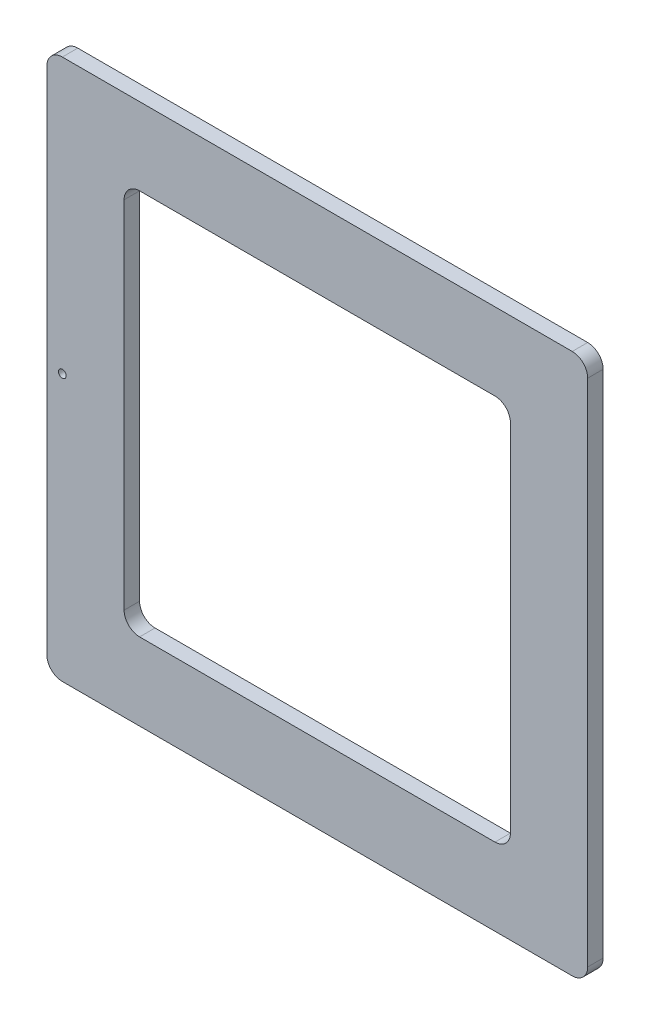
ISO-10303-21;
HEADER;
FILE_DESCRIPTION(('STEP AP214'),'2;1');
FILE_NAME('part.step','',(''),(''),'','','');
FILE_SCHEMA(('AUTOMOTIVE_DESIGN { 1 0 10303 214 1 1 1 1 }'));
ENDSEC;
DATA;
#1=APPLICATION_CONTEXT('core data for automotive mechanical design processes');
#2=APPLICATION_PROTOCOL_DEFINITION('international standard','automotive_design',2000,#1);
#3=PRODUCT_CONTEXT('',#1,'mechanical');
#4=PRODUCT('Part','Part','',(#3));
#5=PRODUCT_RELATED_PRODUCT_CATEGORY('part','',(#4));
#6=PRODUCT_DEFINITION_FORMATION('','',#4);
#7=PRODUCT_DEFINITION_CONTEXT('part definition',#1,'design');
#8=PRODUCT_DEFINITION('design','',#6,#7);
#9=PRODUCT_DEFINITION_SHAPE('','',#8);
#10=(LENGTH_UNIT() NAMED_UNIT(*) SI_UNIT(.MILLI.,.METRE.));
#11=(NAMED_UNIT(*) PLANE_ANGLE_UNIT() SI_UNIT($,.RADIAN.));
#12=(NAMED_UNIT(*) SI_UNIT($,.STERADIAN.) SOLID_ANGLE_UNIT());
#13=UNCERTAINTY_MEASURE_WITH_UNIT(LENGTH_MEASURE(1.E-05),#10,'distance_accuracy_value','');
#14=(GEOMETRIC_REPRESENTATION_CONTEXT(3) GLOBAL_UNCERTAINTY_ASSIGNED_CONTEXT((#13)) GLOBAL_UNIT_ASSIGNED_CONTEXT((#10,
#11,#12)) REPRESENTATION_CONTEXT('',''));
#15=CARTESIAN_POINT('',(0.,0.,0.));
#16=DIRECTION('',(0.,0.,1.));
#17=DIRECTION('',(1.,0.,0.));
#18=AXIS2_PLACEMENT_3D('',#15,#16,#17);
#19=CARTESIAN_POINT('',(33.,33.,2.));
#20=DIRECTION('',(0.,0.,-1.));
#21=DIRECTION('',(-1.,0.,0.));
#22=AXIS2_PLACEMENT_3D('',#19,#20,#21);
#23=PLANE('',#22);
#24=CARTESIAN_POINT('',(-33.,-0.499999999999987,2.));
#25=DIRECTION('',(0.,0.,1.));
#26=DIRECTION('',(1.,0.,0.));
#27=AXIS2_PLACEMENT_3D('',#24,#25,#26);
#28=CIRCLE('',#27,0.499999999999999);
#29=CARTESIAN_POINT('',(-32.5,-0.499999999999987,2.));
#30=VERTEX_POINT('',#29);
#31=EDGE_CURVE('E185',#30,#30,#28,.T.);
#32=ORIENTED_EDGE('',*,*,#31,.F.);
#33=EDGE_LOOP('',(#32));
#34=FACE_BOUND('',#33,.T.);
#35=CARTESIAN_POINT('',(33.,33.,2.));
#36=DIRECTION('',(0.,0.,1.));
#37=DIRECTION('',(-1.,0.,0.));
#38=AXIS2_PLACEMENT_3D('',#35,#36,#37);
#39=CIRCLE('',#38,2.);
#40=CARTESIAN_POINT('',(35.,33.,2.));
#41=VERTEX_POINT('',#40);
#42=CARTESIAN_POINT('',(33.,35.,2.));
#43=VERTEX_POINT('',#42);
#44=EDGE_CURVE('E215',#41,#43,#39,.T.);
#45=ORIENTED_EDGE('',*,*,#44,.T.);
#46=DIRECTION('',(-1.,0.,0.));
#47=VECTOR('',#46,1.);
#48=CARTESIAN_POINT('',(33.,35.,2.));
#49=LINE('',#48,#47);
#50=CARTESIAN_POINT('',(-33.,35.,2.));
#51=VERTEX_POINT('',#50);
#52=EDGE_CURVE('E218',#43,#51,#49,.T.);
#53=ORIENTED_EDGE('',*,*,#52,.T.);
#54=CARTESIAN_POINT('',(-33.,33.,2.));
#55=DIRECTION('',(0.,0.,1.));
#56=DIRECTION('',(-1.,0.,0.));
#57=AXIS2_PLACEMENT_3D('',#54,#55,#56);
#58=CIRCLE('',#57,2.);
#59=CARTESIAN_POINT('',(-35.,33.,2.));
#60=VERTEX_POINT('',#59);
#61=EDGE_CURVE('E221',#51,#60,#58,.T.);
#62=ORIENTED_EDGE('',*,*,#61,.T.);
#63=DIRECTION('',(0.,-1.,0.));
#64=VECTOR('',#63,1.);
#65=CARTESIAN_POINT('',(-35.,-33.,2.));
#66=LINE('',#65,#64);
#67=CARTESIAN_POINT('',(-35.,-33.,2.));
#68=VERTEX_POINT('',#67);
#69=EDGE_CURVE('E223',#60,#68,#66,.T.);
#70=ORIENTED_EDGE('',*,*,#69,.T.);
#71=CARTESIAN_POINT('',(-33.,-33.,2.));
#72=DIRECTION('',(0.,0.,1.));
#73=DIRECTION('',(-1.,0.,0.));
#74=AXIS2_PLACEMENT_3D('',#71,#72,#73);
#75=CIRCLE('',#74,2.);
#76=CARTESIAN_POINT('',(-33.,-35.,2.));
#77=VERTEX_POINT('',#76);
#78=EDGE_CURVE('E225',#68,#77,#75,.T.);
#79=ORIENTED_EDGE('',*,*,#78,.T.);
#80=DIRECTION('',(1.,0.,0.));
#81=VECTOR('',#80,1.);
#82=CARTESIAN_POINT('',(33.,-35.,2.));
#83=LINE('',#82,#81);
#84=CARTESIAN_POINT('',(33.,-35.,2.));
#85=VERTEX_POINT('',#84);
#86=EDGE_CURVE('E227',#77,#85,#83,.T.);
#87=ORIENTED_EDGE('',*,*,#86,.T.);
#88=CARTESIAN_POINT('',(33.,-33.,2.));
#89=DIRECTION('',(0.,0.,1.));
#90=DIRECTION('',(-1.,0.,0.));
#91=AXIS2_PLACEMENT_3D('',#88,#89,#90);
#92=CIRCLE('',#91,2.);
#93=CARTESIAN_POINT('',(35.,-33.,2.));
#94=VERTEX_POINT('',#93);
#95=EDGE_CURVE('E229',#85,#94,#92,.T.);
#96=ORIENTED_EDGE('',*,*,#95,.T.);
#97=DIRECTION('',(0.,1.,0.));
#98=VECTOR('',#97,1.);
#99=CARTESIAN_POINT('',(35.,-33.,2.));
#100=LINE('',#99,#98);
#101=EDGE_CURVE('E231',#94,#41,#100,.T.);
#102=ORIENTED_EDGE('',*,*,#101,.T.);
#103=EDGE_LOOP('',(#45,#53,#62,#70,#79,#87,#96,#102));
#104=FACE_BOUND('',#103,.T.);
#105=CARTESIAN_POINT('',(23.,-23.,2.));
#106=DIRECTION('',(0.,0.,1.));
#107=DIRECTION('',(-1.,0.,0.));
#108=AXIS2_PLACEMENT_3D('',#105,#106,#107);
#109=CIRCLE('',#108,2.);
#110=CARTESIAN_POINT('',(23.,-25.,2.));
#111=VERTEX_POINT('',#110);
#112=CARTESIAN_POINT('',(25.,-23.,2.));
#113=VERTEX_POINT('',#112);
#114=EDGE_CURVE('E148',#111,#113,#109,.T.);
#115=ORIENTED_EDGE('',*,*,#114,.F.);
#116=DIRECTION('',(1.,0.,0.));
#117=VECTOR('',#116,1.);
#118=CARTESIAN_POINT('',(23.,-25.,2.));
#119=LINE('',#118,#117);
#120=CARTESIAN_POINT('',(-23.,-25.,2.));
#121=VERTEX_POINT('',#120);
#122=EDGE_CURVE('E182',#121,#111,#119,.T.);
#123=ORIENTED_EDGE('',*,*,#122,.F.);
#124=CARTESIAN_POINT('',(-23.,-23.,2.));
#125=DIRECTION('',(0.,0.,1.));
#126=DIRECTION('',(-1.,0.,0.));
#127=AXIS2_PLACEMENT_3D('',#124,#125,#126);
#128=CIRCLE('',#127,2.);
#129=CARTESIAN_POINT('',(-25.,-23.,2.));
#130=VERTEX_POINT('',#129);
#131=EDGE_CURVE('E180',#130,#121,#128,.T.);
#132=ORIENTED_EDGE('',*,*,#131,.F.);
#133=DIRECTION('',(0.,-1.,0.));
#134=VECTOR('',#133,1.);
#135=CARTESIAN_POINT('',(-25.,-23.,2.));
#136=LINE('',#135,#134);
#137=CARTESIAN_POINT('',(-25.,23.,2.));
#138=VERTEX_POINT('',#137);
#139=EDGE_CURVE('E178',#138,#130,#136,.T.);
#140=ORIENTED_EDGE('',*,*,#139,.F.);
#141=CARTESIAN_POINT('',(-23.,23.,2.));
#142=DIRECTION('',(0.,0.,1.));
#143=DIRECTION('',(1.,0.,0.));
#144=AXIS2_PLACEMENT_3D('',#141,#142,#143);
#145=CIRCLE('',#144,2.);
#146=CARTESIAN_POINT('',(-23.,25.,2.));
#147=VERTEX_POINT('',#146);
#148=EDGE_CURVE('E176',#147,#138,#145,.T.);
#149=ORIENTED_EDGE('',*,*,#148,.F.);
#150=DIRECTION('',(-1.,0.,0.));
#151=VECTOR('',#150,1.);
#152=CARTESIAN_POINT('',(23.,25.,2.));
#153=LINE('',#152,#151);
#154=CARTESIAN_POINT('',(23.,25.,2.));
#155=VERTEX_POINT('',#154);
#156=EDGE_CURVE('E171',#155,#147,#153,.T.);
#157=ORIENTED_EDGE('',*,*,#156,.F.);
#158=CARTESIAN_POINT('',(23.,23.,2.));
#159=DIRECTION('',(0.,0.,1.));
#160=DIRECTION('',(-1.,0.,0.));
#161=AXIS2_PLACEMENT_3D('',#158,#159,#160);
#162=CIRCLE('',#161,2.);
#163=CARTESIAN_POINT('',(25.,23.,2.));
#164=VERTEX_POINT('',#163);
#165=EDGE_CURVE('E169',#164,#155,#162,.T.);
#166=ORIENTED_EDGE('',*,*,#165,.F.);
#167=DIRECTION('',(0.,1.,0.));
#168=VECTOR('',#167,1.);
#169=CARTESIAN_POINT('',(25.,-23.,2.));
#170=LINE('',#169,#168);
#171=EDGE_CURVE('E156',#113,#164,#170,.T.);
#172=ORIENTED_EDGE('',*,*,#171,.F.);
#173=EDGE_LOOP('',(#115,#123,#132,#140,#149,#157,#166,#172));
#174=FACE_BOUND('',#173,.T.);
#175=ADVANCED_FACE('F35',(#34,#104,#174),#23,.F.);
#176=CARTESIAN_POINT('',(33.,33.,0.));
#177=DIRECTION('',(0.,0.,-1.));
#178=DIRECTION('',(-1.,0.,0.));
#179=AXIS2_PLACEMENT_3D('',#176,#177,#178);
#180=PLANE('',#179);
#181=CARTESIAN_POINT('',(-33.,-0.499999999999987,0.));
#182=DIRECTION('',(0.,0.,1.));
#183=DIRECTION('',(1.,0.,0.));
#184=AXIS2_PLACEMENT_3D('',#181,#182,#183);
#185=CIRCLE('',#184,0.499999999999999);
#186=CARTESIAN_POINT('',(-32.5,-0.499999999999987,0.));
#187=VERTEX_POINT('',#186);
#188=EDGE_CURVE('E370',#187,#187,#185,.T.);
#189=ORIENTED_EDGE('',*,*,#188,.T.);
#190=EDGE_LOOP('',(#189));
#191=FACE_BOUND('',#190,.T.);
#192=CARTESIAN_POINT('',(33.,33.,0.));
#193=DIRECTION('',(0.,0.,1.));
#194=DIRECTION('',(-1.,0.,0.));
#195=AXIS2_PLACEMENT_3D('',#192,#193,#194);
#196=CIRCLE('',#195,2.);
#197=CARTESIAN_POINT('',(35.,33.,0.));
#198=VERTEX_POINT('',#197);
#199=CARTESIAN_POINT('',(33.,35.,0.));
#200=VERTEX_POINT('',#199);
#201=EDGE_CURVE('E164',#198,#200,#196,.T.);
#202=ORIENTED_EDGE('',*,*,#201,.F.);
#203=DIRECTION('',(0.,1.,0.));
#204=VECTOR('',#203,1.);
#205=CARTESIAN_POINT('',(35.,-33.,0.));
#206=LINE('',#205,#204);
#207=CARTESIAN_POINT('',(35.,-33.,0.));
#208=VERTEX_POINT('',#207);
#209=EDGE_CURVE('E219',#208,#198,#206,.T.);
#210=ORIENTED_EDGE('',*,*,#209,.F.);
#211=CARTESIAN_POINT('',(33.,-33.,0.));
#212=DIRECTION('',(0.,0.,1.));
#213=DIRECTION('',(-1.,0.,0.));
#214=AXIS2_PLACEMENT_3D('',#211,#212,#213);
#215=CIRCLE('',#214,2.);
#216=CARTESIAN_POINT('',(33.,-35.,0.));
#217=VERTEX_POINT('',#216);
#218=EDGE_CURVE('E246',#217,#208,#215,.T.);
#219=ORIENTED_EDGE('',*,*,#218,.F.);
#220=DIRECTION('',(1.,0.,0.));
#221=VECTOR('',#220,1.);
#222=CARTESIAN_POINT('',(33.,-35.,0.));
#223=LINE('',#222,#221);
#224=CARTESIAN_POINT('',(-33.,-35.,0.));
#225=VERTEX_POINT('',#224);
#226=EDGE_CURVE('E244',#225,#217,#223,.T.);
#227=ORIENTED_EDGE('',*,*,#226,.F.);
#228=CARTESIAN_POINT('',(-33.,-33.,0.));
#229=DIRECTION('',(0.,0.,1.));
#230=DIRECTION('',(-1.,0.,0.));
#231=AXIS2_PLACEMENT_3D('',#228,#229,#230);
#232=CIRCLE('',#231,2.);
#233=CARTESIAN_POINT('',(-35.,-33.,0.));
#234=VERTEX_POINT('',#233);
#235=EDGE_CURVE('E242',#234,#225,#232,.T.);
#236=ORIENTED_EDGE('',*,*,#235,.F.);
#237=DIRECTION('',(0.,-1.,0.));
#238=VECTOR('',#237,1.);
#239=CARTESIAN_POINT('',(-35.,-33.,0.));
#240=LINE('',#239,#238);
#241=CARTESIAN_POINT('',(-35.,33.,0.));
#242=VERTEX_POINT('',#241);
#243=EDGE_CURVE('E240',#242,#234,#240,.T.);
#244=ORIENTED_EDGE('',*,*,#243,.F.);
#245=CARTESIAN_POINT('',(-33.,33.,0.));
#246=DIRECTION('',(0.,0.,1.));
#247=DIRECTION('',(-1.,0.,0.));
#248=AXIS2_PLACEMENT_3D('',#245,#246,#247);
#249=CIRCLE('',#248,2.);
#250=CARTESIAN_POINT('',(-33.,35.,0.));
#251=VERTEX_POINT('',#250);
#252=EDGE_CURVE('E238',#251,#242,#249,.T.);
#253=ORIENTED_EDGE('',*,*,#252,.F.);
#254=DIRECTION('',(-1.,0.,0.));
#255=VECTOR('',#254,1.);
#256=CARTESIAN_POINT('',(33.,35.,0.));
#257=LINE('',#256,#255);
#258=EDGE_CURVE('E236',#200,#251,#257,.T.);
#259=ORIENTED_EDGE('',*,*,#258,.F.);
#260=EDGE_LOOP('',(#202,#210,#219,#227,#236,#244,#253,#259));
#261=FACE_BOUND('',#260,.T.);
#262=DIRECTION('',(1.,0.,0.));
#263=VECTOR('',#262,1.);
#264=CARTESIAN_POINT('',(23.,-25.,0.));
#265=LINE('',#264,#263);
#266=CARTESIAN_POINT('',(-23.,-25.,0.));
#267=VERTEX_POINT('',#266);
#268=CARTESIAN_POINT('',(23.,-25.,0.));
#269=VERTEX_POINT('',#268);
#270=EDGE_CURVE('E157',#267,#269,#265,.T.);
#271=ORIENTED_EDGE('',*,*,#270,.T.);
#272=CARTESIAN_POINT('',(23.,-23.,0.));
#273=DIRECTION('',(0.,0.,1.));
#274=DIRECTION('',(-1.,0.,0.));
#275=AXIS2_PLACEMENT_3D('',#272,#273,#274);
#276=CIRCLE('',#275,2.);
#277=CARTESIAN_POINT('',(25.,-23.,0.));
#278=VERTEX_POINT('',#277);
#279=EDGE_CURVE('E58',#269,#278,#276,.T.);
#280=ORIENTED_EDGE('',*,*,#279,.T.);
#281=DIRECTION('',(0.,1.,0.));
#282=VECTOR('',#281,1.);
#283=CARTESIAN_POINT('',(25.,-23.,0.));
#284=LINE('',#283,#282);
#285=CARTESIAN_POINT('',(25.,23.,0.));
#286=VERTEX_POINT('',#285);
#287=EDGE_CURVE('E163',#278,#286,#284,.T.);
#288=ORIENTED_EDGE('',*,*,#287,.T.);
#289=CARTESIAN_POINT('',(23.,23.,0.));
#290=DIRECTION('',(0.,0.,1.));
#291=DIRECTION('',(-1.,0.,0.));
#292=AXIS2_PLACEMENT_3D('',#289,#290,#291);
#293=CIRCLE('',#292,2.);
#294=CARTESIAN_POINT('',(23.,25.,0.));
#295=VERTEX_POINT('',#294);
#296=EDGE_CURVE('E187',#286,#295,#293,.T.);
#297=ORIENTED_EDGE('',*,*,#296,.T.);
#298=DIRECTION('',(-1.,0.,0.));
#299=VECTOR('',#298,1.);
#300=CARTESIAN_POINT('',(23.,25.,0.));
#301=LINE('',#300,#299);
#302=CARTESIAN_POINT('',(-23.,25.,0.));
#303=VERTEX_POINT('',#302);
#304=EDGE_CURVE('E190',#295,#303,#301,.T.);
#305=ORIENTED_EDGE('',*,*,#304,.T.);
#306=CARTESIAN_POINT('',(-23.,23.,0.));
#307=DIRECTION('',(0.,0.,1.));
#308=DIRECTION('',(1.,0.,0.));
#309=AXIS2_PLACEMENT_3D('',#306,#307,#308);
#310=CIRCLE('',#309,2.);
#311=CARTESIAN_POINT('',(-25.,23.,0.));
#312=VERTEX_POINT('',#311);
#313=EDGE_CURVE('E193',#303,#312,#310,.T.);
#314=ORIENTED_EDGE('',*,*,#313,.T.);
#315=DIRECTION('',(0.,-1.,0.));
#316=VECTOR('',#315,1.);
#317=CARTESIAN_POINT('',(-25.,-23.,0.));
#318=LINE('',#317,#316);
#319=CARTESIAN_POINT('',(-25.,-23.,0.));
#320=VERTEX_POINT('',#319);
#321=EDGE_CURVE('E196',#312,#320,#318,.T.);
#322=ORIENTED_EDGE('',*,*,#321,.T.);
#323=CARTESIAN_POINT('',(-23.,-23.,0.));
#324=DIRECTION('',(0.,0.,1.));
#325=DIRECTION('',(-1.,0.,0.));
#326=AXIS2_PLACEMENT_3D('',#323,#324,#325);
#327=CIRCLE('',#326,2.);
#328=EDGE_CURVE('E199',#320,#267,#327,.T.);
#329=ORIENTED_EDGE('',*,*,#328,.T.);
#330=EDGE_LOOP('',(#271,#280,#288,#297,#305,#314,#322,#329));
#331=FACE_BOUND('',#330,.T.);
#332=ADVANCED_FACE('F276',(#191,#261,#331),#180,.T.);
#333=CARTESIAN_POINT('',(33.,33.,2.));
#334=DIRECTION('',(0.,0.,-1.));
#335=DIRECTION('',(-1.,0.,0.));
#336=AXIS2_PLACEMENT_3D('',#333,#334,#335);
#337=CYLINDRICAL_SURFACE('',#336,2.);
#338=ORIENTED_EDGE('',*,*,#201,.T.);
#339=DIRECTION('',(0.,0.,-1.));
#340=VECTOR('',#339,1.);
#341=CARTESIAN_POINT('',(33.,35.,2.));
#342=LINE('',#341,#340);
#343=EDGE_CURVE('E11',#43,#200,#342,.T.);
#344=ORIENTED_EDGE('',*,*,#343,.F.);
#345=ORIENTED_EDGE('',*,*,#44,.F.);
#346=DIRECTION('',(0.,0.,-1.));
#347=VECTOR('',#346,1.);
#348=CARTESIAN_POINT('',(35.,33.,2.));
#349=LINE('',#348,#347);
#350=EDGE_CURVE('E233',#41,#198,#349,.T.);
#351=ORIENTED_EDGE('',*,*,#350,.T.);
#352=EDGE_LOOP('',(#338,#344,#345,#351));
#353=FACE_BOUND('',#352,.T.);
#354=ADVANCED_FACE('F37',(#353),#337,.T.);
#355=CARTESIAN_POINT('',(33.,35.,2.));
#356=DIRECTION('',(0.,-1.,0.));
#357=DIRECTION('',(1.,0.,0.));
#358=AXIS2_PLACEMENT_3D('',#355,#356,#357);
#359=PLANE('',#358);
#360=ORIENTED_EDGE('',*,*,#258,.T.);
#361=DIRECTION('',(0.,0.,-1.));
#362=VECTOR('',#361,1.);
#363=CARTESIAN_POINT('',(-33.,35.,2.));
#364=LINE('',#363,#362);
#365=EDGE_CURVE('E43',#51,#251,#364,.T.);
#366=ORIENTED_EDGE('',*,*,#365,.F.);
#367=ORIENTED_EDGE('',*,*,#52,.F.);
#368=ORIENTED_EDGE('',*,*,#343,.T.);
#369=EDGE_LOOP('',(#360,#366,#367,#368));
#370=FACE_BOUND('',#369,.T.);
#371=ADVANCED_FACE('F293',(#370),#359,.F.);
#372=CARTESIAN_POINT('',(-33.,33.,2.));
#373=DIRECTION('',(0.,0.,-1.));
#374=DIRECTION('',(-1.,0.,0.));
#375=AXIS2_PLACEMENT_3D('',#372,#373,#374);
#376=CYLINDRICAL_SURFACE('',#375,2.);
#377=ORIENTED_EDGE('',*,*,#252,.T.);
#378=DIRECTION('',(0.,0.,-1.));
#379=VECTOR('',#378,1.);
#380=CARTESIAN_POINT('',(-35.,33.,2.));
#381=LINE('',#380,#379);
#382=EDGE_CURVE('E263',#60,#242,#381,.T.);
#383=ORIENTED_EDGE('',*,*,#382,.F.);
#384=ORIENTED_EDGE('',*,*,#61,.F.);
#385=ORIENTED_EDGE('',*,*,#365,.T.);
#386=EDGE_LOOP('',(#377,#383,#384,#385));
#387=FACE_BOUND('',#386,.T.);
#388=ADVANCED_FACE('F270',(#387),#376,.T.);
#389=CARTESIAN_POINT('',(-35.,-33.,2.));
#390=DIRECTION('',(1.,0.,0.));
#391=DIRECTION('',(0.,0.,-1.));
#392=AXIS2_PLACEMENT_3D('',#389,#390,#391);
#393=PLANE('',#392);
#394=ORIENTED_EDGE('',*,*,#243,.T.);
#395=DIRECTION('',(0.,0.,-1.));
#396=VECTOR('',#395,1.);
#397=CARTESIAN_POINT('',(-35.,-33.,2.));
#398=LINE('',#397,#396);
#399=EDGE_CURVE('E260',#68,#234,#398,.T.);
#400=ORIENTED_EDGE('',*,*,#399,.F.);
#401=ORIENTED_EDGE('',*,*,#69,.F.);
#402=ORIENTED_EDGE('',*,*,#382,.T.);
#403=EDGE_LOOP('',(#394,#400,#401,#402));
#404=FACE_BOUND('',#403,.T.);
#405=ADVANCED_FACE('F282',(#404),#393,.F.);
#406=CARTESIAN_POINT('',(-33.,-33.,2.));
#407=DIRECTION('',(0.,0.,-1.));
#408=DIRECTION('',(-1.,0.,0.));
#409=AXIS2_PLACEMENT_3D('',#406,#407,#408);
#410=CYLINDRICAL_SURFACE('',#409,2.);
#411=ORIENTED_EDGE('',*,*,#235,.T.);
#412=DIRECTION('',(0.,0.,-1.));
#413=VECTOR('',#412,1.);
#414=CARTESIAN_POINT('',(-33.,-35.,2.));
#415=LINE('',#414,#413);
#416=EDGE_CURVE('E257',#77,#225,#415,.T.);
#417=ORIENTED_EDGE('',*,*,#416,.F.);
#418=ORIENTED_EDGE('',*,*,#78,.F.);
#419=ORIENTED_EDGE('',*,*,#399,.T.);
#420=EDGE_LOOP('',(#411,#417,#418,#419));
#421=FACE_BOUND('',#420,.T.);
#422=ADVANCED_FACE('F286',(#421),#410,.T.);
#423=CARTESIAN_POINT('',(33.,-35.,2.));
#424=DIRECTION('',(0.,1.,0.));
#425=DIRECTION('',(-1.,0.,0.));
#426=AXIS2_PLACEMENT_3D('',#423,#424,#425);
#427=PLANE('',#426);
#428=ORIENTED_EDGE('',*,*,#226,.T.);
#429=DIRECTION('',(0.,0.,-1.));
#430=VECTOR('',#429,1.);
#431=CARTESIAN_POINT('',(33.,-35.,2.));
#432=LINE('',#431,#430);
#433=EDGE_CURVE('E254',#85,#217,#432,.T.);
#434=ORIENTED_EDGE('',*,*,#433,.F.);
#435=ORIENTED_EDGE('',*,*,#86,.F.);
#436=ORIENTED_EDGE('',*,*,#416,.T.);
#437=EDGE_LOOP('',(#428,#434,#435,#436));
#438=FACE_BOUND('',#437,.T.);
#439=ADVANCED_FACE('F306',(#438),#427,.F.);
#440=CARTESIAN_POINT('',(33.,-33.,2.));
#441=DIRECTION('',(0.,0.,-1.));
#442=DIRECTION('',(-1.,0.,0.));
#443=AXIS2_PLACEMENT_3D('',#440,#441,#442);
#444=CYLINDRICAL_SURFACE('',#443,2.);
#445=ORIENTED_EDGE('',*,*,#218,.T.);
#446=DIRECTION('',(0.,0.,-1.));
#447=VECTOR('',#446,1.);
#448=CARTESIAN_POINT('',(35.,-33.,2.));
#449=LINE('',#448,#447);
#450=EDGE_CURVE('E251',#94,#208,#449,.T.);
#451=ORIENTED_EDGE('',*,*,#450,.F.);
#452=ORIENTED_EDGE('',*,*,#95,.F.);
#453=ORIENTED_EDGE('',*,*,#433,.T.);
#454=EDGE_LOOP('',(#445,#451,#452,#453));
#455=FACE_BOUND('',#454,.T.);
#456=ADVANCED_FACE('F304',(#455),#444,.T.);
#457=CARTESIAN_POINT('',(35.,-33.,2.));
#458=DIRECTION('',(-1.,0.,0.));
#459=DIRECTION('',(0.,-1.,0.));
#460=AXIS2_PLACEMENT_3D('',#457,#458,#459);
#461=PLANE('',#460);
#462=ORIENTED_EDGE('',*,*,#209,.T.);
#463=ORIENTED_EDGE('',*,*,#350,.F.);
#464=ORIENTED_EDGE('',*,*,#101,.F.);
#465=ORIENTED_EDGE('',*,*,#450,.T.);
#466=EDGE_LOOP('',(#462,#463,#464,#465));
#467=FACE_BOUND('',#466,.T.);
#468=ADVANCED_FACE('F299',(#467),#461,.F.);
#469=CARTESIAN_POINT('',(23.,-23.,2.));
#470=DIRECTION('',(0.,0.,-1.));
#471=DIRECTION('',(-1.,0.,0.));
#472=AXIS2_PLACEMENT_3D('',#469,#470,#471);
#473=CYLINDRICAL_SURFACE('',#472,2.);
#474=ORIENTED_EDGE('',*,*,#279,.F.);
#475=DIRECTION('',(0.,0.,-1.));
#476=VECTOR('',#475,1.);
#477=CARTESIAN_POINT('',(23.,-25.,2.));
#478=LINE('',#477,#476);
#479=EDGE_CURVE('E152',#111,#269,#478,.T.);
#480=ORIENTED_EDGE('',*,*,#479,.F.);
#481=ORIENTED_EDGE('',*,*,#114,.T.);
#482=DIRECTION('',(0.,0.,-1.));
#483=VECTOR('',#482,1.);
#484=CARTESIAN_POINT('',(25.,-23.,2.));
#485=LINE('',#484,#483);
#486=EDGE_CURVE('E151',#113,#278,#485,.T.);
#487=ORIENTED_EDGE('',*,*,#486,.T.);
#488=EDGE_LOOP('',(#474,#480,#481,#487));
#489=FACE_BOUND('',#488,.T.);
#490=ADVANCED_FACE('F150',(#489),#473,.F.);
#491=CARTESIAN_POINT('',(25.,-23.,2.));
#492=DIRECTION('',(-1.,0.,0.));
#493=DIRECTION('',(0.,0.,1.));
#494=AXIS2_PLACEMENT_3D('',#491,#492,#493);
#495=PLANE('',#494);
#496=ORIENTED_EDGE('',*,*,#287,.F.);
#497=ORIENTED_EDGE('',*,*,#486,.F.);
#498=ORIENTED_EDGE('',*,*,#171,.T.);
#499=DIRECTION('',(0.,0.,-1.));
#500=VECTOR('',#499,1.);
#501=CARTESIAN_POINT('',(25.,23.,2.));
#502=LINE('',#501,#500);
#503=EDGE_CURVE('E165',#164,#286,#502,.T.);
#504=ORIENTED_EDGE('',*,*,#503,.T.);
#505=EDGE_LOOP('',(#496,#497,#498,#504));
#506=FACE_BOUND('',#505,.T.);
#507=ADVANCED_FACE('F160',(#506),#495,.T.);
#508=CARTESIAN_POINT('',(23.,23.,2.));
#509=DIRECTION('',(0.,0.,-1.));
#510=DIRECTION('',(-1.,0.,0.));
#511=AXIS2_PLACEMENT_3D('',#508,#509,#510);
#512=CYLINDRICAL_SURFACE('',#511,2.);
#513=ORIENTED_EDGE('',*,*,#296,.F.);
#514=ORIENTED_EDGE('',*,*,#503,.F.);
#515=ORIENTED_EDGE('',*,*,#165,.T.);
#516=DIRECTION('',(0.,0.,-1.));
#517=VECTOR('',#516,1.);
#518=CARTESIAN_POINT('',(23.,25.,2.));
#519=LINE('',#518,#517);
#520=EDGE_CURVE('E212',#155,#295,#519,.T.);
#521=ORIENTED_EDGE('',*,*,#520,.T.);
#522=EDGE_LOOP('',(#513,#514,#515,#521));
#523=FACE_BOUND('',#522,.T.);
#524=ADVANCED_FACE('F335',(#523),#512,.F.);
#525=CARTESIAN_POINT('',(23.,25.,2.));
#526=DIRECTION('',(0.,-1.,0.));
#527=DIRECTION('',(1.,0.,0.));
#528=AXIS2_PLACEMENT_3D('',#525,#526,#527);
#529=PLANE('',#528);
#530=ORIENTED_EDGE('',*,*,#304,.F.);
#531=ORIENTED_EDGE('',*,*,#520,.F.);
#532=ORIENTED_EDGE('',*,*,#156,.T.);
#533=DIRECTION('',(0.,0.,-1.));
#534=VECTOR('',#533,1.);
#535=CARTESIAN_POINT('',(-23.,25.,2.));
#536=LINE('',#535,#534);
#537=EDGE_CURVE('E210',#147,#303,#536,.T.);
#538=ORIENTED_EDGE('',*,*,#537,.T.);
#539=EDGE_LOOP('',(#530,#531,#532,#538));
#540=FACE_BOUND('',#539,.T.);
#541=ADVANCED_FACE('F339',(#540),#529,.T.);
#542=CARTESIAN_POINT('',(-23.,23.,2.));
#543=DIRECTION('',(0.,0.,-1.));
#544=DIRECTION('',(-1.,0.,0.));
#545=AXIS2_PLACEMENT_3D('',#542,#543,#544);
#546=CYLINDRICAL_SURFACE('',#545,2.);
#547=ORIENTED_EDGE('',*,*,#313,.F.);
#548=ORIENTED_EDGE('',*,*,#537,.F.);
#549=ORIENTED_EDGE('',*,*,#148,.T.);
#550=DIRECTION('',(0.,0.,-1.));
#551=VECTOR('',#550,1.);
#552=CARTESIAN_POINT('',(-25.,23.,2.));
#553=LINE('',#552,#551);
#554=EDGE_CURVE('E208',#138,#312,#553,.T.);
#555=ORIENTED_EDGE('',*,*,#554,.T.);
#556=EDGE_LOOP('',(#547,#548,#549,#555));
#557=FACE_BOUND('',#556,.T.);
#558=ADVANCED_FACE('F345',(#557),#546,.F.);
#559=CARTESIAN_POINT('',(-25.,-23.,2.));
#560=DIRECTION('',(1.,0.,0.));
#561=DIRECTION('',(0.,0.,-1.));
#562=AXIS2_PLACEMENT_3D('',#559,#560,#561);
#563=PLANE('',#562);
#564=ORIENTED_EDGE('',*,*,#321,.F.);
#565=ORIENTED_EDGE('',*,*,#554,.F.);
#566=ORIENTED_EDGE('',*,*,#139,.T.);
#567=DIRECTION('',(0.,0.,-1.));
#568=VECTOR('',#567,1.);
#569=CARTESIAN_POINT('',(-25.,-23.,2.));
#570=LINE('',#569,#568);
#571=EDGE_CURVE('E206',#130,#320,#570,.T.);
#572=ORIENTED_EDGE('',*,*,#571,.T.);
#573=EDGE_LOOP('',(#564,#565,#566,#572));
#574=FACE_BOUND('',#573,.T.);
#575=ADVANCED_FACE('F349',(#574),#563,.T.);
#576=CARTESIAN_POINT('',(-23.,-23.,2.));
#577=DIRECTION('',(0.,0.,-1.));
#578=DIRECTION('',(-1.,0.,0.));
#579=AXIS2_PLACEMENT_3D('',#576,#577,#578);
#580=CYLINDRICAL_SURFACE('',#579,2.);
#581=ORIENTED_EDGE('',*,*,#328,.F.);
#582=ORIENTED_EDGE('',*,*,#571,.F.);
#583=ORIENTED_EDGE('',*,*,#131,.T.);
#584=DIRECTION('',(0.,0.,-1.));
#585=VECTOR('',#584,1.);
#586=CARTESIAN_POINT('',(-23.,-25.,2.));
#587=LINE('',#586,#585);
#588=EDGE_CURVE('E50',#121,#267,#587,.T.);
#589=ORIENTED_EDGE('',*,*,#588,.T.);
#590=EDGE_LOOP('',(#581,#582,#583,#589));
#591=FACE_BOUND('',#590,.T.);
#592=ADVANCED_FACE('F353',(#591),#580,.F.);
#593=CARTESIAN_POINT('',(23.,-25.,2.));
#594=DIRECTION('',(0.,1.,0.));
#595=DIRECTION('',(-1.,0.,0.));
#596=AXIS2_PLACEMENT_3D('',#593,#594,#595);
#597=PLANE('',#596);
#598=ORIENTED_EDGE('',*,*,#270,.F.);
#599=ORIENTED_EDGE('',*,*,#588,.F.);
#600=ORIENTED_EDGE('',*,*,#122,.T.);
#601=ORIENTED_EDGE('',*,*,#479,.T.);
#602=EDGE_LOOP('',(#598,#599,#600,#601));
#603=FACE_BOUND('',#602,.T.);
#604=ADVANCED_FACE('F357',(#603),#597,.T.);
#605=CARTESIAN_POINT('',(-33.,-0.499999999999987,2.));
#606=DIRECTION('',(0.,0.,-1.));
#607=DIRECTION('',(-1.,0.,0.));
#608=AXIS2_PLACEMENT_3D('',#605,#606,#607);
#609=CYLINDRICAL_SURFACE('',#608,0.499999999999999);
#610=ORIENTED_EDGE('',*,*,#31,.T.);
#611=EDGE_LOOP('',(#610));
#612=FACE_BOUND('',#611,.T.);
#613=ORIENTED_EDGE('',*,*,#188,.F.);
#614=EDGE_LOOP('',(#613));
#615=FACE_BOUND('',#614,.T.);
#616=ADVANCED_FACE('F361',(#612,#615),#609,.F.);
#617=CLOSED_SHELL('',(#175,#332,#354,#371,#388,#405,#422,#439,#456,#468,#490,#507,#524,#541,
#558,#575,#592,#604,#616));
#618=MANIFOLD_SOLID_BREP('B2',#617);
#619=ADVANCED_BREP_SHAPE_REPRESENTATION('',(#18,#618),#14);
#620=SHAPE_DEFINITION_REPRESENTATION(#9,#619);
ENDSEC;
END-ISO-10303-21;
